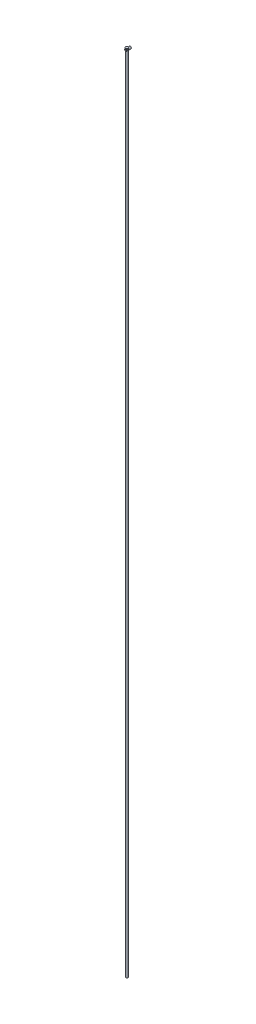
ISO-10303-21;
HEADER;
FILE_DESCRIPTION(('STEP AP214'),'2;1');
FILE_NAME('part.step','',(''),(''),'','','');
FILE_SCHEMA(('AUTOMOTIVE_DESIGN { 1 0 10303 214 1 1 1 1 }'));
ENDSEC;
DATA;
#1=APPLICATION_CONTEXT('core data for automotive mechanical design processes');
#2=APPLICATION_PROTOCOL_DEFINITION('international standard','automotive_design',2000,#1);
#3=PRODUCT_CONTEXT('',#1,'mechanical');
#4=PRODUCT('Part','Part','',(#3));
#5=PRODUCT_RELATED_PRODUCT_CATEGORY('part','',(#4));
#6=PRODUCT_DEFINITION_FORMATION('','',#4);
#7=PRODUCT_DEFINITION_CONTEXT('part definition',#1,'design');
#8=PRODUCT_DEFINITION('design','',#6,#7);
#9=PRODUCT_DEFINITION_SHAPE('','',#8);
#10=(LENGTH_UNIT() NAMED_UNIT(*) SI_UNIT(.MILLI.,.METRE.));
#11=(NAMED_UNIT(*) PLANE_ANGLE_UNIT() SI_UNIT($,.RADIAN.));
#12=(NAMED_UNIT(*) SI_UNIT($,.STERADIAN.) SOLID_ANGLE_UNIT());
#13=UNCERTAINTY_MEASURE_WITH_UNIT(LENGTH_MEASURE(1.E-05),#10,'distance_accuracy_value','');
#14=(GEOMETRIC_REPRESENTATION_CONTEXT(3) GLOBAL_UNCERTAINTY_ASSIGNED_CONTEXT((#13)) GLOBAL_UNIT_ASSIGNED_CONTEXT((#10,
#11,#12)) REPRESENTATION_CONTEXT('',''));
#15=CARTESIAN_POINT('',(0.,0.,0.));
#16=DIRECTION('',(0.,0.,1.));
#17=DIRECTION('',(1.,0.,0.));
#18=AXIS2_PLACEMENT_3D('',#15,#16,#17);
#19=CARTESIAN_POINT('',(0.,17.7,37.25));
#20=DIRECTION('',(0.,-1.,0.));
#21=DIRECTION('',(0.,0.,-1.));
#22=AXIS2_PLACEMENT_3D('',#19,#20,#21);
#23=CYLINDRICAL_SURFACE('',#22,14.5);
#24=CARTESIAN_POINT('',(0.,17.7,37.25));
#25=DIRECTION('',(0.,1.,0.));
#26=DIRECTION('',(0.,0.,1.));
#27=AXIS2_PLACEMENT_3D('',#24,#25,#26);
#28=CIRCLE('',#27,14.5);
#29=CARTESIAN_POINT('',(0.,17.7,51.75));
#30=VERTEX_POINT('',#29);
#31=EDGE_CURVE('E11',#30,#30,#28,.T.);
#32=ORIENTED_EDGE('',*,*,#31,.F.);
#33=EDGE_LOOP('',(#32));
#34=FACE_BOUND('',#33,.T.);
#35=CARTESIAN_POINT('',(0.,12.7,37.25));
#36=DIRECTION('',(0.,1.,0.));
#37=DIRECTION('',(0.,0.,1.));
#38=AXIS2_PLACEMENT_3D('',#35,#36,#37);
#39=CIRCLE('',#38,14.5);
#40=CARTESIAN_POINT('',(0.,12.7,51.75));
#41=VERTEX_POINT('',#40);
#42=EDGE_CURVE('E46',#41,#41,#39,.T.);
#43=ORIENTED_EDGE('',*,*,#42,.T.);
#44=EDGE_LOOP('',(#43));
#45=FACE_BOUND('',#44,.T.);
#46=ADVANCED_FACE('F43',(#34,#45),#23,.T.);
#47=CARTESIAN_POINT('',(0.,17.7,37.25));
#48=DIRECTION('',(0.,1.,0.));
#49=DIRECTION('',(0.,0.,1.));
#50=AXIS2_PLACEMENT_3D('',#47,#48,#49);
#51=PLANE('',#50);
#52=ORIENTED_EDGE('',*,*,#31,.T.);
#53=EDGE_LOOP('',(#52));
#54=FACE_BOUND('',#53,.T.);
#55=ADVANCED_FACE('F58',(#54),#51,.T.);
#56=CARTESIAN_POINT('',(0.,12.7,37.25));
#57=DIRECTION('',(0.,1.,0.));
#58=DIRECTION('',(0.,0.,1.));
#59=AXIS2_PLACEMENT_3D('',#56,#57,#58);
#60=PLANE('',#59);
#61=ORIENTED_EDGE('',*,*,#42,.F.);
#62=EDGE_LOOP('',(#61));
#63=FACE_BOUND('',#62,.T.);
#64=ADVANCED_FACE('F56',(#63),#60,.F.);
#65=CLOSED_SHELL('',(#46,#55,#64));
#66=MANIFOLD_SOLID_BREP('B2',#65);
#67=CARTESIAN_POINT('',(0.,12.7,37.25));
#68=DIRECTION('',(0.,-1.,0.));
#69=DIRECTION('',(0.,0.,-1.));
#70=AXIS2_PLACEMENT_3D('',#67,#68,#69);
#71=CYLINDRICAL_SURFACE('',#70,10.);
#72=CARTESIAN_POINT('',(0.,12.7,37.25));
#73=DIRECTION('',(0.,1.,0.));
#74=DIRECTION('',(0.,0.,1.));
#75=AXIS2_PLACEMENT_3D('',#72,#73,#74);
#76=CIRCLE('',#75,10.);
#77=CARTESIAN_POINT('',(0.,12.7,47.25));
#78=VERTEX_POINT('',#77);
#79=EDGE_CURVE('E177',#78,#78,#76,.T.);
#80=ORIENTED_EDGE('',*,*,#79,.T.);
#81=EDGE_LOOP('',(#80));
#82=FACE_BOUND('',#81,.T.);
#83=CARTESIAN_POINT('',(0.,-8981.8,37.25));
#84=DIRECTION('',(0.,1.,0.));
#85=DIRECTION('',(0.,0.,1.));
#86=AXIS2_PLACEMENT_3D('',#83,#84,#85);
#87=CIRCLE('',#86,10.);
#88=CARTESIAN_POINT('',(0.,-8981.8,47.25));
#89=VERTEX_POINT('',#88);
#90=EDGE_CURVE('E175',#89,#89,#87,.T.);
#91=ORIENTED_EDGE('',*,*,#90,.F.);
#92=EDGE_LOOP('',(#91));
#93=FACE_BOUND('',#92,.T.);
#94=DIRECTION('',(0.,-1.,0.));
#95=VECTOR('',#94,1.);
#96=CARTESIAN_POINT('',(-8.79985795339902,12.7,42.));
#97=LINE('',#96,#95);
#98=CARTESIAN_POINT('',(-8.79985795339902,4.75,42.));
#99=VERTEX_POINT('',#98);
#100=CARTESIAN_POINT('',(-8.79985795339902,-4.75,42.));
#101=VERTEX_POINT('',#100);
#102=EDGE_CURVE('E167',#99,#101,#97,.T.);
#103=ORIENTED_EDGE('',*,*,#102,.F.);
#104=CARTESIAN_POINT('',(0.,0.,37.25));
#105=DIRECTION('',(0.,-0.707106781186547,0.707106781186547));
#106=DIRECTION('',(0.,-0.707106781186547,-0.707106781186547));
#107=AXIS2_PLACEMENT_3D('',#104,#105,#106);
#108=ELLIPSE('',#107,14.142135623731,10.);
#109=CARTESIAN_POINT('',(-10.,0.,37.25));
#110=VERTEX_POINT('',#109);
#111=EDGE_CURVE('E41',#99,#110,#108,.T.);
#112=ORIENTED_EDGE('',*,*,#111,.T.);
#113=CARTESIAN_POINT('',(0.,0.,37.25));
#114=DIRECTION('',(0.,-0.707106781186547,-0.707106781186547));
#115=DIRECTION('',(0.,-0.707106781186547,0.707106781186547));
#116=AXIS2_PLACEMENT_3D('',#113,#114,#115);
#117=ELLIPSE('',#116,14.142135623731,10.);
#118=CARTESIAN_POINT('',(10.,0.,37.25));
#119=VERTEX_POINT('',#118);
#120=EDGE_CURVE('E163',#110,#119,#117,.T.);
#121=ORIENTED_EDGE('',*,*,#120,.T.);
#122=CARTESIAN_POINT('',(8.79985795339902,4.75,42.));
#123=VERTEX_POINT('',#122);
#124=EDGE_CURVE('E110',#119,#123,#108,.T.);
#125=ORIENTED_EDGE('',*,*,#124,.T.);
#126=DIRECTION('',(0.,-1.,0.));
#127=VECTOR('',#126,1.);
#128=CARTESIAN_POINT('',(8.79985795339902,12.7,42.));
#129=LINE('',#128,#127);
#130=CARTESIAN_POINT('',(8.79985795339902,-4.75,42.));
#131=VERTEX_POINT('',#130);
#132=EDGE_CURVE('E148',#131,#123,#129,.F.);
#133=ORIENTED_EDGE('',*,*,#132,.F.);
#134=CARTESIAN_POINT('',(0.,0.,37.25));
#135=DIRECTION('',(0.,-0.707106781186547,-0.707106781186547));
#136=DIRECTION('',(0.,-0.707106781186547,0.707106781186547));
#137=AXIS2_PLACEMENT_3D('',#134,#135,#136);
#138=ELLIPSE('',#137,14.142135623731,10.);
#139=EDGE_CURVE('E159',#131,#119,#138,.F.);
#140=ORIENTED_EDGE('',*,*,#139,.T.);
#141=CARTESIAN_POINT('',(0.,0.,37.25));
#142=DIRECTION('',(0.,-0.707106781186547,0.707106781186547));
#143=DIRECTION('',(0.,-0.707106781186547,-0.707106781186547));
#144=AXIS2_PLACEMENT_3D('',#141,#142,#143);
#145=ELLIPSE('',#144,14.142135623731,10.);
#146=EDGE_CURVE('E104',#119,#110,#145,.F.);
#147=ORIENTED_EDGE('',*,*,#146,.T.);
#148=EDGE_CURVE('E117',#110,#101,#138,.F.);
#149=ORIENTED_EDGE('',*,*,#148,.T.);
#150=EDGE_LOOP('',(#103,#112,#121,#125,#133,#140,#147,#149));
#151=FACE_BOUND('',#150,.T.);
#152=ADVANCED_FACE('F100',(#82,#93,#151),#71,.F.);
#153=CARTESIAN_POINT('',(0.,0.,50.));
#154=DIRECTION('',(0.,0.,-1.));
#155=DIRECTION('',(-1.,0.,0.));
#156=AXIS2_PLACEMENT_3D('',#153,#154,#155);
#157=CYLINDRICAL_SURFACE('',#156,12.7);
#158=CARTESIAN_POINT('',(0.,0.,50.));
#159=DIRECTION('',(0.,0.,1.));
#160=DIRECTION('',(1.,0.,0.));
#161=AXIS2_PLACEMENT_3D('',#158,#159,#160);
#162=CIRCLE('',#161,12.7);
#163=CARTESIAN_POINT('',(12.7,0.,50.));
#164=VERTEX_POINT('',#163);
#165=EDGE_CURVE('E153',#164,#164,#162,.T.);
#166=ORIENTED_EDGE('',*,*,#165,.F.);
#167=EDGE_LOOP('',(#166));
#168=FACE_BOUND('',#167,.T.);
#169=CARTESIAN_POINT('',(0.,0.,37.25));
#170=DIRECTION('',(0.,0.707106781186547,-0.707106781186547));
#171=DIRECTION('',(0.,-0.707106781186547,-0.707106781186547));
#172=AXIS2_PLACEMENT_3D('',#169,#170,#171);
#173=ELLIPSE('',#172,17.9605122421383,12.7);
#174=CARTESIAN_POINT('',(-12.7,0.,37.25));
#175=VERTEX_POINT('',#174);
#176=CARTESIAN_POINT('',(0.,12.7,49.95));
#177=VERTEX_POINT('',#176);
#178=EDGE_CURVE('E195',#175,#177,#173,.T.);
#179=ORIENTED_EDGE('',*,*,#178,.F.);
#180=CARTESIAN_POINT('',(0.,0.,37.25));
#181=DIRECTION('',(0.,-0.707106781186547,-0.707106781186547));
#182=DIRECTION('',(0.,0.707106781186547,-0.707106781186547));
#183=AXIS2_PLACEMENT_3D('',#180,#181,#182);
#184=ELLIPSE('',#183,17.9605122421383,12.7);
#185=CARTESIAN_POINT('',(12.7,0.,37.25));
#186=VERTEX_POINT('',#185);
#187=EDGE_CURVE('E196',#186,#175,#184,.T.);
#188=ORIENTED_EDGE('',*,*,#187,.F.);
#189=EDGE_CURVE('E192',#177,#186,#173,.T.);
#190=ORIENTED_EDGE('',*,*,#189,.F.);
#191=EDGE_LOOP('',(#179,#188,#190));
#192=FACE_BOUND('',#191,.T.);
#193=ADVANCED_FACE('F102',(#168,#192),#157,.T.);
#194=CARTESIAN_POINT('',(0.,0.,50.));
#195=DIRECTION('',(0.,0.,-1.));
#196=DIRECTION('',(-1.,0.,0.));
#197=AXIS2_PLACEMENT_3D('',#194,#195,#196);
#198=CYLINDRICAL_SURFACE('',#197,10.);
#199=CARTESIAN_POINT('',(0.,0.,50.));
#200=DIRECTION('',(0.,0.,1.));
#201=DIRECTION('',(1.,0.,0.));
#202=AXIS2_PLACEMENT_3D('',#199,#200,#201);
#203=CIRCLE('',#202,10.);
#204=CARTESIAN_POINT('',(10.,0.,50.));
#205=VERTEX_POINT('',#204);
#206=EDGE_CURVE('E203',#205,#205,#203,.T.);
#207=ORIENTED_EDGE('',*,*,#206,.T.);
#208=EDGE_LOOP('',(#207));
#209=FACE_BOUND('',#208,.T.);
#210=CARTESIAN_POINT('',(-10.,0.,45.0787930104199));
#211=CARTESIAN_POINT('',(-9.99999805815857,0.191670573828492,45.0787974832573));
#212=CARTESIAN_POINT('',(-9.99447497746972,0.383406133867141,45.0858662707411));
#213=CARTESIAN_POINT('',(-9.97250884718192,0.765313588756671,45.1138011465454));
#214=CARTESIAN_POINT('',(-9.95605863044523,0.955484374331894,45.134676290453));
#215=CARTESIAN_POINT('',(-9.91255764912071,1.33320244236064,45.1892956225936));
#216=CARTESIAN_POINT('',(-9.88548110310687,1.52074218652995,45.2230711040355));
#217=CARTESIAN_POINT('',(-9.82124585409459,1.89172212520715,45.3020626754452));
#218=CARTESIAN_POINT('',(-9.78408051991939,2.0751595371886,45.347286288738));
#219=CARTESIAN_POINT('',(-9.68623467928203,2.49766040988095,45.4642831618775));
#220=CARTESIAN_POINT('',(-9.62184671726241,2.73480936157186,45.5398773867213));
#221=CARTESIAN_POINT('',(-9.47750904667557,3.19938050771683,45.7045129996511));
#222=CARTESIAN_POINT('',(-9.39755920314871,3.42680261779448,45.7935545043564));
#223=CARTESIAN_POINT('',(-9.22295743665719,3.87226310226318,45.9817562058623));
#224=CARTESIAN_POINT('',(-9.12827082679683,4.09027774636794,46.0809400815186));
#225=CARTESIAN_POINT('',(-8.9251416866759,4.51636484062271,46.2861888604855));
#226=CARTESIAN_POINT('',(-8.81669940984043,4.72443747384041,46.3922536370096));
#227=CARTESIAN_POINT('',(-8.54801303376274,5.19891399563765,46.6449937373182));
#228=CARTESIAN_POINT('',(-8.3825888795235,5.4614938323625,46.7933651888994));
#229=CARTESIAN_POINT('',(-8.02891785999726,5.96927370763319,47.0927753919726));
#230=CARTESIAN_POINT('',(-7.84066333590808,6.21446786992915,47.2438150239496));
#231=CARTESIAN_POINT('',(-7.44191528151569,6.68680303181704,47.5441812009007));
#232=CARTESIAN_POINT('',(-7.23143912090672,6.91395789212142,47.6935089842033));
#233=CARTESIAN_POINT('',(-6.78843061090914,7.34939559617894,47.9867472163022));
#234=CARTESIAN_POINT('',(-6.55590529479926,7.55768441668137,48.130659372261));
#235=CARTESIAN_POINT('',(-6.11584379487886,7.9158544829802,48.3827379290572));
#236=CARTESIAN_POINT('',(-5.91207394660055,8.06927416035829,48.4924646320669));
#237=CARTESIAN_POINT('',(-5.4906663571227,8.36171831040266,48.7041763875731));
#238=CARTESIAN_POINT('',(-5.27303125293626,8.50074550722947,48.8061629041274));
#239=CARTESIAN_POINT('',(-4.82466551725888,8.76298873645464,49.0004138517875));
#240=CARTESIAN_POINT('',(-4.59395046494531,8.88622303148626,49.0926894898833));
#241=CARTESIAN_POINT('',(-4.1200506146922,9.11561535229038,49.2657720111395));
#242=CARTESIAN_POINT('',(-3.87686782347546,9.22177611479476,49.3465807320974));
#243=CARTESIAN_POINT('',(-3.4185008432597,9.40023667616281,49.4832211926097));
#244=CARTESIAN_POINT('',(-3.20494025269987,9.47523613434663,49.5409822362782));
#245=CARTESIAN_POINT('',(-2.77088769686995,9.61113283214116,49.646048373456));
#246=CARTESIAN_POINT('',(-2.55039703034248,9.67203269642288,49.6933554129268));
#247=CARTESIAN_POINT('',(-2.10378627234855,9.77889473180411,49.7765980876453));
#248=CARTESIAN_POINT('',(-1.87766808568913,9.8248618852531,49.8125375156292));
#249=CARTESIAN_POINT('',(-1.42122055951704,9.90119534133085,49.8723256705484));
#250=CARTESIAN_POINT('',(-1.19089116909549,9.93156145523067,49.8961742512181));
#251=CARTESIAN_POINT('',(-0.726961692733212,9.97627220265631,49.931317550063));
#252=CARTESIAN_POINT('',(-0.493353397198388,9.99056432949113,49.9425711252805));
#253=CARTESIAN_POINT('',(-0.0254425280351421,10.0027058079316,49.9521301091889));
#254=CARTESIAN_POINT('',(0.208860046876378,10.0005551291303,49.9504354939353));
#255=CARTESIAN_POINT('',(0.676296590058159,9.97984771297104,49.9341365476772));
#256=CARTESIAN_POINT('',(0.909430490022836,9.96129002766076,49.9195314707413));
#257=CARTESIAN_POINT('',(1.37270197600838,9.90808015378967,49.8777385678919));
#258=CARTESIAN_POINT('',(1.60283962010331,9.8734282776487,49.8505509862296));
#259=CARTESIAN_POINT('',(2.0469685376619,9.79072782975831,49.7858575358539));
#260=CARTESIAN_POINT('',(2.261189086502,9.74344226974809,49.7489406126362));
#261=CARTESIAN_POINT('',(2.68426475138706,9.63547633643378,49.6649608551225));
#262=CARTESIAN_POINT('',(2.89311799114001,9.57479134822565,49.6178945253951));
#263=CARTESIAN_POINT('',(3.30428972001542,9.44078483727433,49.5144447395557));
#264=CARTESIAN_POINT('',(3.5066096703116,9.36746616363139,49.4580633842504));
#265=CARTESIAN_POINT('',(3.90399514548854,9.2089418927794,49.3368524682416));
#266=CARTESIAN_POINT('',(4.09905798804505,9.12373195461382,49.2720198229311));
#267=CARTESIAN_POINT('',(4.50018046600647,8.93322061234472,49.1280533883504));
#268=CARTESIAN_POINT('',(4.70541250179956,8.82676477740118,49.0481389755572));
#269=CARTESIAN_POINT('',(5.10567054917903,8.6014493998431,48.8805325495029));
#270=CARTESIAN_POINT('',(5.30069227902506,8.48258471509463,48.7928373142051));
#271=CARTESIAN_POINT('',(5.86984076804226,8.10869617384204,48.5199469858718));
#272=CARTESIAN_POINT('',(6.22815368247445,7.83632830958103,48.324909293852));
#273=CARTESIAN_POINT('',(6.76631185425463,7.36811214767717,48.0000280330324));
#274=CARTESIAN_POINT('',(6.96049231971981,7.18486999261125,47.8750785321154));
#275=CARTESIAN_POINT('',(7.3326419933312,6.80463720003111,47.6217381666728));
#276=CARTESIAN_POINT('',(7.5106084064748,6.60764420242403,47.4933467137367));
#277=CARTESIAN_POINT('',(7.8502235548401,6.20035492302583,47.235465449886));
#278=CARTESIAN_POINT('',(8.01185552096181,5.99004532331451,47.1059746552395));
#279=CARTESIAN_POINT('',(8.31834737089189,5.55657641275707,46.8487027650908));
#280=CARTESIAN_POINT('',(8.46320966341496,5.33341895422702,46.7209214263883));
#281=CARTESIAN_POINT('',(8.71828021373013,4.90364968657669,46.4862152758828));
#282=CARTESIAN_POINT('',(8.83055080221719,4.69857561031722,46.3787142123633));
#283=CARTESIAN_POINT('',(9.0415405892156,4.27852577588186,46.1697857061226));
#284=CARTESIAN_POINT('',(9.14025875650865,4.06354926587949,46.0683587259156));
#285=CARTESIAN_POINT('',(9.32325074730349,3.62402622743343,45.8746575513922));
#286=CARTESIAN_POINT('',(9.40754957638356,3.39949712707375,45.7823676314126));
#287=CARTESIAN_POINT('',(9.56089956048116,2.94068720655702,45.6101732472699));
#288=CARTESIAN_POINT('',(9.62995677162718,2.7064103037444,45.5302638675783));
#289=CARTESIAN_POINT('',(9.73496351724023,2.29402889090852,45.4062964455178));
#290=CARTESIAN_POINT('',(9.77480385059243,2.11806269580637,45.35840796071));
#291=CARTESIAN_POINT('',(9.84523669585909,1.76188691314449,45.2727423071545));
#292=CARTESIAN_POINT('',(9.87583203398944,1.58167864059292,45.2349620487046));
#293=CARTESIAN_POINT('',(9.92722580295701,1.21812499910667,45.1709771024619));
#294=CARTESIAN_POINT('',(9.94804015318192,1.03478523461886,45.1447536094087));
#295=CARTESIAN_POINT('',(9.97952392559278,0.665858727776321,45.1049190827142));
#296=CARTESIAN_POINT('',(9.99019349892538,0.480272018940462,45.0913078611632));
#297=CARTESIAN_POINT('',(10.0011686811844,0.107468415048885,45.0773052943595));
#298=CARTESIAN_POINT('',(10.0014285355343,-0.0797520598778819,45.0769723119227));
#299=CARTESIAN_POINT('',(9.99146264413141,-0.453447975786698,45.0896898189762));
#300=CARTESIAN_POINT('',(9.98123697732456,-0.639923422367495,45.1027402077025));
#301=CARTESIAN_POINT('',(9.95051979060003,-1.01085584508074,45.1416261539713));
#302=CARTESIAN_POINT('',(9.93001789186583,-1.19531058748593,45.1674746370454));
#303=CARTESIAN_POINT('',(9.8791539943564,-1.56090225214776,45.2308494634334));
#304=CARTESIAN_POINT('',(9.8487859339286,-1.74203706221692,45.268382985303));
#305=CARTESIAN_POINT('',(9.76867027503941,-2.15130807252827,45.3659177566836));
#306=CARTESIAN_POINT('',(9.71586327634931,-2.37804676608787,45.4292750970168));
#307=CARTESIAN_POINT('',(9.59592497711941,-2.82337943368968,45.5696592456558));
#308=CARTESIAN_POINT('',(9.5287864671135,-3.04196924318443,45.6466929305514));
#309=CARTESIAN_POINT('',(9.38102612501862,-3.47101686617402,45.8114610893537));
#310=CARTESIAN_POINT('',(9.30037120727208,-3.68145312588519,45.8992216744679));
#311=CARTESIAN_POINT('',(9.12650377503826,-4.09352458389539,46.0824910103393));
#312=CARTESIAN_POINT('',(9.0332909176341,-4.29515954166008,46.1779999726514));
#313=CARTESIAN_POINT('',(8.79453727792093,-4.76997293998519,46.4143112955965));
#314=CARTESIAN_POINT('',(8.64312972720548,-5.03890798176979,46.5577407814257));
#315=CARTESIAN_POINT('',(8.3176320018612,-5.55979767500253,46.8497329175987));
#316=CARTESIAN_POINT('',(8.14353288842694,-5.81174557510816,46.9982975737852));
#317=CARTESIAN_POINT('',(7.773278397241,-6.29837905308058,47.2960227856914));
#318=CARTESIAN_POINT('',(7.5771285249679,-6.53306891571439,47.4451831837401));
#319=CARTESIAN_POINT('',(7.16308204786583,-6.98455633020726,47.7402269470585));
#320=CARTESIAN_POINT('',(6.94519163619624,-7.20135894558256,47.8861112311598));
#321=CARTESIAN_POINT('',(6.52229880402203,-7.58474468081452,48.1496342840766));
#322=CARTESIAN_POINT('',(6.32028555634529,-7.75397704155372,48.2682216056805));
#323=CARTESIAN_POINT('',(5.90098744249708,-8.07765225852442,48.4983561801894));
#324=CARTESIAN_POINT('',(5.6837051715005,-8.23209761751352,48.6099046233584));
#325=CARTESIAN_POINT('',(5.23457794674048,-8.52472469156405,48.823719031172));
#326=CARTESIAN_POINT('',(5.00275273518928,-8.66292775307268,48.9259971379594));
#327=CARTESIAN_POINT('',(4.52502356168396,-8.9217666955784,49.1193098010466));
#328=CARTESIAN_POINT('',(4.27912232784897,-9.042405964718,49.2103465253489));
#329=CARTESIAN_POINT('',(3.81888472140638,-9.24487478948076,49.3642141601129));
#330=CARTESIAN_POINT('',(3.60662168365548,-9.32979714934888,49.4291885191316));
#331=CARTESIAN_POINT('',(3.17424069067062,-9.4856195473241,49.5489630751082));
#332=CARTESIAN_POINT('',(2.95412433752082,-9.55652242632941,49.6037653331958));
#333=CARTESIAN_POINT('',(2.5072423557922,-9.6833703455738,49.7021507730396));
#334=CARTESIAN_POINT('',(2.28047904352121,-9.73932052929714,49.7457378124565));
#335=CARTESIAN_POINT('',(1.82165139503586,-9.83547259515242,49.8208240950933));
#336=CARTESIAN_POINT('',(1.58958699427523,-9.87567428542177,49.8523231910469));
#337=CARTESIAN_POINT('',(1.12082258850566,-9.93981664654723,49.9026501975764));
#338=CARTESIAN_POINT('',(0.884106948289055,-9.96368669584029,49.9214230740439));
#339=CARTESIAN_POINT('',(0.408890730911164,-9.99447346489567,49.9456452824216));
#340=CARTESIAN_POINT('',(0.170390150405797,-10.0013901528879,49.9510945893639));
#341=CARTESIAN_POINT('',(-0.306407456354153,-9.99814732407787,49.9485412208722));
#342=CARTESIAN_POINT('',(-0.544704493352118,-9.98798877243829,49.9405393057565));
#343=CARTESIAN_POINT('',(-1.01914279690834,-9.95077702820658,49.9112728908696));
#344=CARTESIAN_POINT('',(-1.25528414198709,-9.92372445348609,49.8900088761382));
#345=CARTESIAN_POINT('',(-1.70749954095619,-9.85561259415809,49.8366074509829));
#346=CARTESIAN_POINT('',(-1.92383941049257,-9.81564080068703,49.8053154957865));
#347=CARTESIAN_POINT('',(-2.3517939436588,-9.72198851882831,49.7322354912164));
#348=CARTESIAN_POINT('',(-2.56340698679816,-9.66830340524483,49.6904439006292));
#349=CARTESIAN_POINT('',(-2.98065838839873,-9.54792252803636,49.5971203023841));
#350=CARTESIAN_POINT('',(-3.18629735553965,-9.48122809526907,49.5455892910889));
#351=CARTESIAN_POINT('',(-3.59070640338908,-9.33557875537364,49.4336308773463));
#352=CARTESIAN_POINT('',(-3.78947557695844,-9.25662223657234,49.3732023054981));
#353=CARTESIAN_POINT('',(-4.19493113037283,-9.08048595307556,49.2392326028021));
#354=CARTESIAN_POINT('',(-4.40098532986379,-8.98235519661417,49.1650301635558));
#355=CARTESIAN_POINT('',(-4.80350201811789,-8.77369764916572,49.008529194134));
#356=CARTESIAN_POINT('',(-4.99996402380166,-8.66317023478398,48.9262302568328));
#357=CARTESIAN_POINT('',(-5.38285878536505,-8.43060028331427,48.7547315549168));
#358=CARTESIAN_POINT('',(-5.56928895220244,-8.3085547957813,48.6655300232074));
#359=CARTESIAN_POINT('',(-5.93176396400999,-8.05377333383848,48.4814517143503));
#360=CARTESIAN_POINT('',(-6.10780740778689,-7.92103592274989,48.386574174957));
#361=CARTESIAN_POINT('',(-6.48282145742549,-7.61852395613613,48.173288644845));
#362=CARTESIAN_POINT('',(-6.67950883204925,-7.44659394637307,48.0539176764377));
#363=CARTESIAN_POINT('',(-7.05745595583547,-7.08942333537221,47.8109085203085));
#364=CARTESIAN_POINT('',(-7.23871771477047,-6.90418447393571,47.6872708914405));
#365=CARTESIAN_POINT('',(-7.58594736549982,-6.52076637880485,47.4376971164227));
#366=CARTESIAN_POINT('',(-7.7518936324187,-6.322569503164,47.3117580122117));
#367=CARTESIAN_POINT('',(-8.06801388938606,-5.91387303549313,47.0600945941047));
#368=CARTESIAN_POINT('',(-8.21818916437035,-5.70337444791907,46.9343702635325));
#369=CARTESIAN_POINT('',(-8.49688806783055,-5.27871536853923,46.690646038068));
#370=CARTESIAN_POINT('',(-8.62603086887391,-5.0650243276552,46.5725367982605));
#371=CARTESIAN_POINT('',(-8.86906264786431,-4.62629667852783,46.3416344526658));
#372=CARTESIAN_POINT('',(-8.98294930812613,-4.40125835355709,46.2288421563022));
#373=CARTESIAN_POINT('',(-9.19457853793921,-3.9400533839278,46.0120000292425));
#374=CARTESIAN_POINT('',(-9.29234254922932,-3.70390206503813,45.9079386791639));
#375=CARTESIAN_POINT('',(-9.47081352808136,-3.22025666250128,45.7123409337534));
#376=CARTESIAN_POINT('',(-9.55152925511201,-2.97276848370859,45.6207981149219));
#377=CARTESIAN_POINT('',(-9.67310403141698,-2.54263312749311,45.4796396429746));
#378=CARTESIAN_POINT('',(-9.71866300929067,-2.36273555351754,45.4256735404386));
#379=CARTESIAN_POINT('',(-9.80012720741249,-1.99809332334833,45.3278438783295));
#380=CARTESIAN_POINT('',(-9.83603576740308,-1.81335036836337,45.2839768245106));
#381=CARTESIAN_POINT('',(-9.89752761271168,-1.4403362568203,45.2080985971444));
#382=CARTESIAN_POINT('',(-9.92314205963339,-1.252077581486,45.1760516671587));
#383=CARTESIAN_POINT('',(-9.96366800054479,-0.872724925797174,45.1250491067697));
#384=CARTESIAN_POINT('',(-9.97858680939074,-0.681632974614704,45.1060845295476));
#385=CARTESIAN_POINT('',(-9.99199016702721,-0.40841395830398,45.0890154335866));
#386=CARTESIAN_POINT('',(-9.99499184475385,-0.326817899882708,45.0851865963619));
#387=CARTESIAN_POINT('',(-9.99899732422626,-0.163485180876221,45.0800742412551));
#388=CARTESIAN_POINT('',(-10.0000008282055,-0.0817485011518444,45.0787911027314));
#389=CARTESIAN_POINT('',(-10.,0.,45.0787930104199));
#390=B_SPLINE_CURVE_WITH_KNOTS('',3,(#210,#211,#212,#213,#214,#215,#216,#217,#218,#219,#220,
#221,#222,#223,#224,#225,#226,#227,#228,#229,#230,#231,#232,#233,#234,#235,#236,#237,#238,#239,
#240,#241,#242,#243,#244,#245,#246,#247,#248,#249,#250,#251,#252,#253,#254,#255,#256,#257,#258,
#259,#260,#261,#262,#263,#264,#265,#266,#267,#268,#269,#270,#271,#272,#273,#274,#275,#276,#277,
#278,#279,#280,#281,#282,#283,#284,#285,#286,#287,#288,#289,#290,#291,#292,#293,#294,#295,#296,
#297,#298,#299,#300,#301,#302,#303,#304,#305,#306,#307,#308,#309,#310,#311,#312,#313,#314,#315,
#316,#317,#318,#319,#320,#321,#322,#323,#324,#325,#326,#327,#328,#329,#330,#331,#332,#333,#334,
#335,#336,#337,#338,#339,#340,#341,#342,#343,#344,#345,#346,#347,#348,#349,#350,#351,#352,#353,
#354,#355,#356,#357,#358,#359,#360,#361,#362,#363,#364,#365,#366,#367,#368,#369,#370,#371,#372,
#373,#374,#375,#376,#377,#378,#379,#380,#381,#382,#383,#384,#385,#386,#387,#388,#389),
.UNSPECIFIED.,.T.,.F.,(4,2,2,2,2,2,2,2,2,2,2,2,2,2,2,2,2,2,2,2,2,2,2,2,2,2,2,2,2,2,2,2,2,2,2,2,
2,2,2,2,2,2,2,2,2,2,2,2,2,2,2,2,2,2,2,2,2,2,2,2,2,2,2,2,2,2,2,2,2,2,2,2,2,2,2,2,2,2,2,2,2,2,2,2,
2,2,2,2,2,4),(0.,0.57491928644027,1.15021603681901,1.72691727834511,2.30399849676866,
3.07408382883579,3.84417583972683,4.61610867207376,5.38802728491713,6.41867254138656,
7.44966450521414,8.47985647130158,9.5097209233224,10.3419726053628,11.1740664724646,
12.005189267541,12.836178708133,13.5362714955026,14.2362338540561,14.9359624273572,
15.6356994652177,16.3377156589615,17.0397331509114,17.7417912061755,18.4438356336839,
19.1105054614974,19.7774052565554,20.4441548512954,21.1111484856259,21.844282318923,
22.5777211724678,24.0442410857393,24.9279571417226,25.811825246906,26.6965917135427,
27.5812309385122,28.3526502036702,29.1241281344537,29.8942543207823,30.664073950851,
31.2235938945965,31.7829426183843,32.3413777742129,32.8998046098063,33.460685670422,
34.0215625081643,34.5830069667185,35.1447970244759,35.8674949327003,36.5905572544599,
37.3154160670313,38.0402946771762,39.0598930073351,40.0798942050176,41.0996412992055,
42.1190987261257,42.9852527845197,43.8512599828429,44.716115992541,45.580804945546,
46.2931246322874,47.0052998267813,47.7172297283396,48.429168303011,49.1441663208254,
49.8591656785238,50.5741246228821,51.2890574203019,51.9549731663336,52.6211138080771,
53.2871863391162,53.953346489926,54.6726159148501,55.3919215261348,56.1114118959271,
56.8309991057692,57.6918448629647,58.5525782900315,59.4145090183438,60.2763694665929,
61.1043406711606,61.9324375173079,62.7594240260476,63.5859845869564,64.1652905492501,
64.7443957708675,65.3217345178315,65.8986780392767,66.143847586434,66.3890536658598),.UNSPECIFIED.);
#391=CARTESIAN_POINT('',(-10.,0.,45.0787930104199));
#392=VERTEX_POINT('',#391);
#393=EDGE_CURVE('E189',#392,#392,#390,.T.);
#394=ORIENTED_EDGE('',*,*,#393,.T.);
#395=EDGE_LOOP('',(#394));
#396=FACE_BOUND('',#395,.T.);
#397=ADVANCED_FACE('F218',(#209,#396),#198,.F.);
#398=CARTESIAN_POINT('',(0.,0.,50.));
#399=DIRECTION('',(0.,0.,1.));
#400=DIRECTION('',(1.,0.,0.));
#401=AXIS2_PLACEMENT_3D('',#398,#399,#400);
#402=PLANE('',#401);
#403=ORIENTED_EDGE('',*,*,#165,.T.);
#404=EDGE_LOOP('',(#403));
#405=FACE_BOUND('',#404,.T.);
#406=ORIENTED_EDGE('',*,*,#206,.F.);
#407=EDGE_LOOP('',(#406));
#408=FACE_BOUND('',#407,.T.);
#409=ADVANCED_FACE('F343',(#405,#408),#402,.T.);
#410=CARTESIAN_POINT('',(0.,12.7,37.25));
#411=DIRECTION('',(0.,-1.,0.));
#412=DIRECTION('',(0.,0.,-1.));
#413=AXIS2_PLACEMENT_3D('',#410,#411,#412);
#414=CYLINDRICAL_SURFACE('',#413,12.7);
#415=ORIENTED_EDGE('',*,*,#393,.F.);
#416=EDGE_LOOP('',(#415));
#417=FACE_BOUND('',#416,.T.);
#418=ADVANCED_FACE('F228',(#417),#414,.T.);
#419=CARTESIAN_POINT('',(0.,-8981.8,37.25));
#420=DIRECTION('',(0.,1.,0.));
#421=DIRECTION('',(0.,0.,1.));
#422=AXIS2_PLACEMENT_3D('',#419,#420,#421);
#423=PLANE('',#422);
#424=ORIENTED_EDGE('',*,*,#90,.T.);
#425=EDGE_LOOP('',(#424));
#426=FACE_BOUND('',#425,.T.);
#427=CARTESIAN_POINT('',(0.,-8981.8,37.25));
#428=DIRECTION('',(0.,1.,0.));
#429=DIRECTION('',(0.,0.,1.));
#430=AXIS2_PLACEMENT_3D('',#427,#428,#429);
#431=CIRCLE('',#430,12.7);
#432=CARTESIAN_POINT('',(0.,-8981.8,49.95));
#433=VERTEX_POINT('',#432);
#434=EDGE_CURVE('E182',#433,#433,#431,.T.);
#435=ORIENTED_EDGE('',*,*,#434,.F.);
#436=EDGE_LOOP('',(#435));
#437=FACE_BOUND('',#436,.T.);
#438=ADVANCED_FACE('F233',(#426,#437),#423,.F.);
#439=ORIENTED_EDGE('',*,*,#434,.T.);
#440=EDGE_LOOP('',(#439));
#441=FACE_BOUND('',#440,.T.);
#442=CARTESIAN_POINT('',(0.,0.,37.25));
#443=DIRECTION('',(0.,0.707106781186547,-0.707106781186547));
#444=DIRECTION('',(0.,-0.707106781186547,-0.707106781186547));
#445=AXIS2_PLACEMENT_3D('',#442,#443,#444);
#446=ELLIPSE('',#445,17.9605122421383,12.7);
#447=EDGE_CURVE('E190',#175,#186,#446,.F.);
#448=ORIENTED_EDGE('',*,*,#447,.T.);
#449=ORIENTED_EDGE('',*,*,#187,.T.);
#450=EDGE_LOOP('',(#448,#449));
#451=FACE_BOUND('',#450,.T.);
#452=ADVANCED_FACE('F231',(#441,#451),#414,.T.);
#453=CARTESIAN_POINT('',(0.,12.7,37.25));
#454=DIRECTION('',(0.,1.,0.));
#455=DIRECTION('',(0.,0.,1.));
#456=AXIS2_PLACEMENT_3D('',#453,#454,#455);
#457=PLANE('',#456);
#458=ORIENTED_EDGE('',*,*,#79,.F.);
#459=EDGE_LOOP('',(#458));
#460=FACE_BOUND('',#459,.T.);
#461=CARTESIAN_POINT('',(0.,12.7,37.25));
#462=DIRECTION('',(0.,1.,0.));
#463=DIRECTION('',(0.,0.,1.));
#464=AXIS2_PLACEMENT_3D('',#461,#462,#463);
#465=CIRCLE('',#464,12.7);
#466=CARTESIAN_POINT('',(0.,12.7,24.55));
#467=VERTEX_POINT('',#466);
#468=EDGE_CURVE('E186',#177,#467,#465,.T.);
#469=ORIENTED_EDGE('',*,*,#468,.T.);
#470=EDGE_CURVE('E185',#467,#177,#465,.T.);
#471=ORIENTED_EDGE('',*,*,#470,.T.);
#472=EDGE_LOOP('',(#469,#471));
#473=FACE_BOUND('',#472,.T.);
#474=ADVANCED_FACE('F226',(#460,#473),#457,.T.);
#475=ORIENTED_EDGE('',*,*,#470,.F.);
#476=CARTESIAN_POINT('',(0.,0.,37.25));
#477=DIRECTION('',(0.,-0.707106781186547,-0.707106781186547));
#478=DIRECTION('',(0.,0.707106781186547,-0.707106781186547));
#479=AXIS2_PLACEMENT_3D('',#476,#477,#478);
#480=ELLIPSE('',#479,17.9605122421383,12.7);
#481=EDGE_CURVE('E202',#467,#175,#480,.F.);
#482=ORIENTED_EDGE('',*,*,#481,.T.);
#483=ORIENTED_EDGE('',*,*,#178,.T.);
#484=EDGE_LOOP('',(#475,#482,#483));
#485=FACE_BOUND('',#484,.T.);
#486=ADVANCED_FACE('F221',(#485),#414,.T.);
#487=ORIENTED_EDGE('',*,*,#189,.T.);
#488=EDGE_CURVE('E199',#186,#467,#480,.F.);
#489=ORIENTED_EDGE('',*,*,#488,.T.);
#490=ORIENTED_EDGE('',*,*,#468,.F.);
#491=EDGE_LOOP('',(#487,#489,#490));
#492=FACE_BOUND('',#491,.T.);
#493=ADVANCED_FACE('F225',(#492),#414,.T.);
#494=CARTESIAN_POINT('',(0.,0.,0.));
#495=DIRECTION('',(0.,0.,1.));
#496=DIRECTION('',(1.,0.,0.));
#497=AXIS2_PLACEMENT_3D('',#494,#495,#496);
#498=CIRCLE('',#497,12.7);
#499=CARTESIAN_POINT('',(12.7,0.,0.));
#500=VERTEX_POINT('',#499);
#501=EDGE_CURVE('E206',#500,#500,#498,.T.);
#502=ORIENTED_EDGE('',*,*,#501,.T.);
#503=EDGE_LOOP('',(#502));
#504=FACE_BOUND('',#503,.T.);
#505=ORIENTED_EDGE('',*,*,#447,.F.);
#506=ORIENTED_EDGE('',*,*,#481,.F.);
#507=ORIENTED_EDGE('',*,*,#488,.F.);
#508=EDGE_LOOP('',(#505,#506,#507));
#509=FACE_BOUND('',#508,.T.);
#510=ADVANCED_FACE('F309',(#504,#509),#157,.T.);
#511=CARTESIAN_POINT('',(0.,0.,0.));
#512=DIRECTION('',(0.,0.,1.));
#513=DIRECTION('',(1.,0.,0.));
#514=AXIS2_PLACEMENT_3D('',#511,#512,#513);
#515=PLANE('',#514);
#516=ORIENTED_EDGE('',*,*,#501,.F.);
#517=EDGE_LOOP('',(#516));
#518=FACE_BOUND('',#517,.T.);
#519=CARTESIAN_POINT('',(0.,0.,0.));
#520=DIRECTION('',(0.,0.,1.));
#521=DIRECTION('',(1.,0.,0.));
#522=AXIS2_PLACEMENT_3D('',#519,#520,#521);
#523=CIRCLE('',#522,10.);
#524=CARTESIAN_POINT('',(10.,0.,0.));
#525=VERTEX_POINT('',#524);
#526=EDGE_CURVE('E207',#525,#525,#523,.T.);
#527=ORIENTED_EDGE('',*,*,#526,.T.);
#528=EDGE_LOOP('',(#527));
#529=FACE_BOUND('',#528,.T.);
#530=ADVANCED_FACE('F246',(#518,#529),#515,.F.);
#531=ORIENTED_EDGE('',*,*,#526,.F.);
#532=EDGE_LOOP('',(#531));
#533=FACE_BOUND('',#532,.T.);
#534=ORIENTED_EDGE('',*,*,#146,.F.);
#535=ORIENTED_EDGE('',*,*,#120,.F.);
#536=EDGE_LOOP('',(#534,#535));
#537=FACE_BOUND('',#536,.T.);
#538=ADVANCED_FACE('F172',(#533,#537),#198,.F.);
#539=CARTESIAN_POINT('',(0.,0.,42.));
#540=DIRECTION('',(0.,0.,1.));
#541=DIRECTION('',(1.,0.,0.));
#542=AXIS2_PLACEMENT_3D('',#539,#540,#541);
#543=PLANE('',#542);
#544=ORIENTED_EDGE('',*,*,#132,.T.);
#545=CARTESIAN_POINT('',(0.,0.,42.));
#546=DIRECTION('',(0.,0.,1.));
#547=DIRECTION('',(1.,0.,0.));
#548=AXIS2_PLACEMENT_3D('',#545,#546,#547);
#549=CIRCLE('',#548,10.);
#550=EDGE_CURVE('E124',#131,#123,#549,.T.);
#551=ORIENTED_EDGE('',*,*,#550,.F.);
#552=EDGE_LOOP('',(#544,#551));
#553=FACE_BOUND('',#552,.T.);
#554=ADVANCED_FACE('F149',(#553),#543,.F.);
#555=CARTESIAN_POINT('',(0.,0.,42.));
#556=DIRECTION('',(0.,0.,-1.));
#557=DIRECTION('',(-1.,0.,0.));
#558=AXIS2_PLACEMENT_3D('',#555,#556,#557);
#559=CYLINDRICAL_SURFACE('',#558,10.);
#560=ORIENTED_EDGE('',*,*,#550,.T.);
#561=ORIENTED_EDGE('',*,*,#124,.F.);
#562=ORIENTED_EDGE('',*,*,#139,.F.);
#563=EDGE_LOOP('',(#560,#561,#562));
#564=FACE_BOUND('',#563,.T.);
#565=ADVANCED_FACE('F157',(#564),#559,.F.);
#566=ORIENTED_EDGE('',*,*,#102,.T.);
#567=EDGE_CURVE('E160',#99,#101,#549,.T.);
#568=ORIENTED_EDGE('',*,*,#567,.F.);
#569=EDGE_LOOP('',(#566,#568));
#570=FACE_BOUND('',#569,.T.);
#571=ADVANCED_FACE('F174',(#570),#543,.F.);
#572=ORIENTED_EDGE('',*,*,#111,.F.);
#573=ORIENTED_EDGE('',*,*,#567,.T.);
#574=ORIENTED_EDGE('',*,*,#148,.F.);
#575=EDGE_LOOP('',(#572,#573,#574));
#576=FACE_BOUND('',#575,.T.);
#577=ADVANCED_FACE('F173',(#576),#559,.F.);
#578=CLOSED_SHELL('',(#152,#193,#397,#409,#418,#438,#452,#474,#486,#493,#510,#530,#538,#554,
#565,#571,#577));
#579=MANIFOLD_SOLID_BREP('B6',#578);
#580=ADVANCED_BREP_SHAPE_REPRESENTATION('',(#18,#66,#579),#14);
#581=SHAPE_DEFINITION_REPRESENTATION(#9,#580);
ENDSEC;
END-ISO-10303-21;
